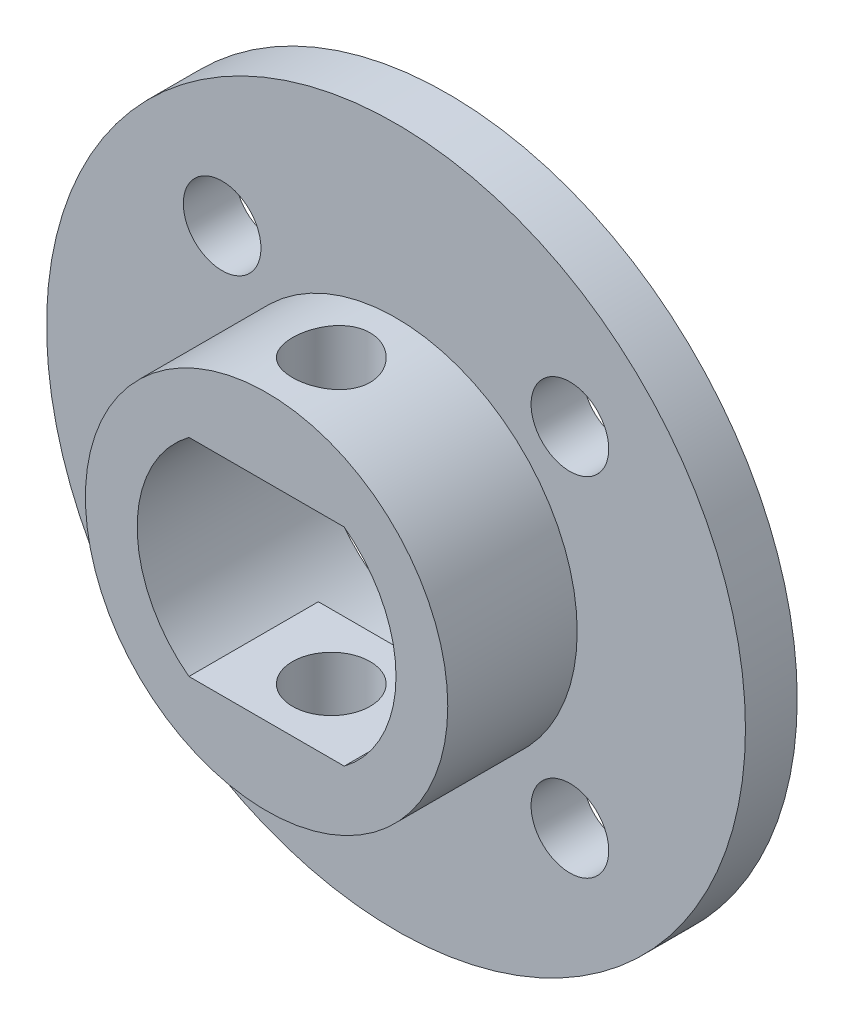
ISO-10303-21;
HEADER;
FILE_DESCRIPTION(('STEP AP214'),'2;1');
FILE_NAME('part.step','',(''),(''),'','','');
FILE_SCHEMA(('AUTOMOTIVE_DESIGN { 1 0 10303 214 1 1 1 1 }'));
ENDSEC;
DATA;
#1=APPLICATION_CONTEXT('core data for automotive mechanical design processes');
#2=APPLICATION_PROTOCOL_DEFINITION('international standard','automotive_design',2000,#1);
#3=PRODUCT_CONTEXT('',#1,'mechanical');
#4=PRODUCT('Part','Part','',(#3));
#5=PRODUCT_RELATED_PRODUCT_CATEGORY('part','',(#4));
#6=PRODUCT_DEFINITION_FORMATION('','',#4);
#7=PRODUCT_DEFINITION_CONTEXT('part definition',#1,'design');
#8=PRODUCT_DEFINITION('design','',#6,#7);
#9=PRODUCT_DEFINITION_SHAPE('','',#8);
#10=(LENGTH_UNIT() NAMED_UNIT(*) SI_UNIT(.MILLI.,.METRE.));
#11=(NAMED_UNIT(*) PLANE_ANGLE_UNIT() SI_UNIT($,.RADIAN.));
#12=(NAMED_UNIT(*) SI_UNIT($,.STERADIAN.) SOLID_ANGLE_UNIT());
#13=UNCERTAINTY_MEASURE_WITH_UNIT(LENGTH_MEASURE(1.E-05),#10,'distance_accuracy_value','');
#14=(GEOMETRIC_REPRESENTATION_CONTEXT(3) GLOBAL_UNCERTAINTY_ASSIGNED_CONTEXT((#13)) GLOBAL_UNIT_ASSIGNED_CONTEXT((#10,
#11,#12)) REPRESENTATION_CONTEXT('',''));
#15=CARTESIAN_POINT('',(0.,0.,0.));
#16=DIRECTION('',(0.,0.,1.));
#17=DIRECTION('',(1.,0.,0.));
#18=AXIS2_PLACEMENT_3D('',#15,#16,#17);
#19=CARTESIAN_POINT('',(-3.,4.,0.));
#20=DIRECTION('',(0.,1.,0.));
#21=DIRECTION('',(0.,0.,1.));
#22=AXIS2_PLACEMENT_3D('',#19,#20,#21);
#23=PLANE('',#22);
#24=CARTESIAN_POINT('',(0.,4.,4.5));
#25=DIRECTION('',(0.,1.,0.));
#26=DIRECTION('',(0.,0.,1.));
#27=AXIS2_PLACEMENT_3D('',#24,#25,#26);
#28=CIRCLE('',#27,1.5);
#29=CARTESIAN_POINT('',(0.,4.,6.));
#30=VERTEX_POINT('',#29);
#31=EDGE_CURVE('E136',#30,#30,#28,.T.);
#32=ORIENTED_EDGE('',*,*,#31,.T.);
#33=EDGE_LOOP('',(#32));
#34=FACE_BOUND('',#33,.T.);
#35=DIRECTION('',(-1.,0.,0.));
#36=VECTOR('',#35,1.);
#37=CARTESIAN_POINT('',(-3.,4.,2.));
#38=LINE('',#37,#36);
#39=CARTESIAN_POINT('',(3.,4.,2.));
#40=VERTEX_POINT('',#39);
#41=CARTESIAN_POINT('',(-3.,4.,2.));
#42=VERTEX_POINT('',#41);
#43=EDGE_CURVE('E72',#40,#42,#38,.T.);
#44=ORIENTED_EDGE('',*,*,#43,.F.);
#45=DIRECTION('',(0.,0.,1.));
#46=VECTOR('',#45,1.);
#47=CARTESIAN_POINT('',(3.,4.,0.));
#48=LINE('',#47,#46);
#49=CARTESIAN_POINT('',(3.,4.,7.));
#50=VERTEX_POINT('',#49);
#51=EDGE_CURVE('E86',#40,#50,#48,.T.);
#52=ORIENTED_EDGE('',*,*,#51,.T.);
#53=DIRECTION('',(-1.,0.,0.));
#54=VECTOR('',#53,1.);
#55=CARTESIAN_POINT('',(-3.,4.,7.));
#56=LINE('',#55,#54);
#57=CARTESIAN_POINT('',(-3.,4.,7.));
#58=VERTEX_POINT('',#57);
#59=EDGE_CURVE('E89',#50,#58,#56,.T.);
#60=ORIENTED_EDGE('',*,*,#59,.T.);
#61=DIRECTION('',(0.,0.,1.));
#62=VECTOR('',#61,1.);
#63=CARTESIAN_POINT('',(-3.,4.,0.));
#64=LINE('',#63,#62);
#65=EDGE_CURVE('E83',#42,#58,#64,.T.);
#66=ORIENTED_EDGE('',*,*,#65,.F.);
#67=EDGE_LOOP('',(#44,#52,#60,#66));
#68=FACE_BOUND('',#67,.T.);
#69=ADVANCED_FACE('F35',(#34,#68),#23,.F.);
#70=CARTESIAN_POINT('',(-3.,-4.,0.));
#71=DIRECTION('',(0.,-1.,0.));
#72=DIRECTION('',(0.,0.,-1.));
#73=AXIS2_PLACEMENT_3D('',#70,#71,#72);
#74=PLANE('',#73);
#75=CARTESIAN_POINT('',(0.,-4.,4.5));
#76=DIRECTION('',(0.,-1.,0.));
#77=DIRECTION('',(0.,0.,-1.));
#78=AXIS2_PLACEMENT_3D('',#75,#76,#77);
#79=CIRCLE('',#78,1.5);
#80=CARTESIAN_POINT('',(0.,-4.,3.));
#81=VERTEX_POINT('',#80);
#82=EDGE_CURVE('E77',#81,#81,#79,.T.);
#83=ORIENTED_EDGE('',*,*,#82,.T.);
#84=EDGE_LOOP('',(#83));
#85=FACE_BOUND('',#84,.T.);
#86=DIRECTION('',(1.,0.,0.));
#87=VECTOR('',#86,1.);
#88=CARTESIAN_POINT('',(-3.,-4.,2.));
#89=LINE('',#88,#87);
#90=CARTESIAN_POINT('',(-3.,-4.,2.));
#91=VERTEX_POINT('',#90);
#92=CARTESIAN_POINT('',(3.,-4.,2.));
#93=VERTEX_POINT('',#92);
#94=EDGE_CURVE('E11',#91,#93,#89,.T.);
#95=ORIENTED_EDGE('',*,*,#94,.F.);
#96=DIRECTION('',(0.,0.,1.));
#97=VECTOR('',#96,1.);
#98=CARTESIAN_POINT('',(-3.,-4.,0.));
#99=LINE('',#98,#97);
#100=CARTESIAN_POINT('',(-3.,-4.,7.));
#101=VERTEX_POINT('',#100);
#102=EDGE_CURVE('E102',#91,#101,#99,.T.);
#103=ORIENTED_EDGE('',*,*,#102,.T.);
#104=DIRECTION('',(1.,0.,0.));
#105=VECTOR('',#104,1.);
#106=CARTESIAN_POINT('',(-3.,-4.,7.));
#107=LINE('',#106,#105);
#108=CARTESIAN_POINT('',(3.,-4.,7.));
#109=VERTEX_POINT('',#108);
#110=EDGE_CURVE('E309',#101,#109,#107,.T.);
#111=ORIENTED_EDGE('',*,*,#110,.T.);
#112=DIRECTION('',(0.,0.,1.));
#113=VECTOR('',#112,1.);
#114=CARTESIAN_POINT('',(3.,-4.,0.));
#115=LINE('',#114,#113);
#116=EDGE_CURVE('E96',#93,#109,#115,.T.);
#117=ORIENTED_EDGE('',*,*,#116,.F.);
#118=EDGE_LOOP('',(#95,#103,#111,#117));
#119=FACE_BOUND('',#118,.T.);
#120=ADVANCED_FACE('F170',(#85,#119),#74,.F.);
#121=CARTESIAN_POINT('',(0.,0.,2.));
#122=DIRECTION('',(0.,0.,1.));
#123=DIRECTION('',(1.,0.,0.));
#124=AXIS2_PLACEMENT_3D('',#121,#122,#123);
#125=PLANE('',#124);
#126=CARTESIAN_POINT('',(0.,0.,2.));
#127=DIRECTION('',(0.,0.,1.));
#128=DIRECTION('',(1.,0.,0.));
#129=AXIS2_PLACEMENT_3D('',#126,#127,#128);
#130=CIRCLE('',#129,7.);
#131=CARTESIAN_POINT('',(7.,0.,2.));
#132=VERTEX_POINT('',#131);
#133=EDGE_CURVE('E91',#132,#132,#130,.T.);
#134=ORIENTED_EDGE('',*,*,#133,.F.);
#135=EDGE_LOOP('',(#134));
#136=FACE_BOUND('',#135,.T.);
#137=CARTESIAN_POINT('',(-6.71751442127186,-6.71751442127254,2.));
#138=DIRECTION('',(0.,0.,1.));
#139=DIRECTION('',(1.,0.,0.));
#140=AXIS2_PLACEMENT_3D('',#137,#138,#139);
#141=CIRCLE('',#140,1.50000000000028);
#142=CARTESIAN_POINT('',(-5.21751442127158,-6.71751442127254,2.));
#143=VERTEX_POINT('',#142);
#144=EDGE_CURVE('E114',#143,#143,#141,.T.);
#145=ORIENTED_EDGE('',*,*,#144,.F.);
#146=EDGE_LOOP('',(#145));
#147=FACE_BOUND('',#146,.T.);
#148=CARTESIAN_POINT('',(6.71751442127224,6.71751442127217,2.));
#149=DIRECTION('',(0.,0.,1.));
#150=DIRECTION('',(1.,0.,0.));
#151=AXIS2_PLACEMENT_3D('',#148,#149,#150);
#152=CIRCLE('',#151,1.5);
#153=CARTESIAN_POINT('',(8.21751442127224,6.71751442127217,2.));
#154=VERTEX_POINT('',#153);
#155=EDGE_CURVE('E126',#154,#154,#152,.T.);
#156=ORIENTED_EDGE('',*,*,#155,.F.);
#157=EDGE_LOOP('',(#156));
#158=FACE_BOUND('',#157,.T.);
#159=CARTESIAN_POINT('',(0.,0.,2.));
#160=DIRECTION('',(0.,0.,1.));
#161=DIRECTION('',(1.,0.,0.));
#162=AXIS2_PLACEMENT_3D('',#159,#160,#161);
#163=CIRCLE('',#162,13.5);
#164=CARTESIAN_POINT('',(13.5,0.,2.));
#165=VERTEX_POINT('',#164);
#166=EDGE_CURVE('E43',#165,#165,#163,.T.);
#167=ORIENTED_EDGE('',*,*,#166,.T.);
#168=EDGE_LOOP('',(#167));
#169=FACE_BOUND('',#168,.T.);
#170=CARTESIAN_POINT('',(6.71751442127254,-6.71751442127224,2.));
#171=DIRECTION('',(0.,0.,1.));
#172=DIRECTION('',(1.,0.,0.));
#173=AXIS2_PLACEMENT_3D('',#170,#171,#172);
#174=CIRCLE('',#173,1.49999999999991);
#175=CARTESIAN_POINT('',(8.21751442127245,-6.71751442127224,2.));
#176=VERTEX_POINT('',#175);
#177=EDGE_CURVE('E120',#176,#176,#174,.T.);
#178=ORIENTED_EDGE('',*,*,#177,.F.);
#179=EDGE_LOOP('',(#178));
#180=FACE_BOUND('',#179,.T.);
#181=CARTESIAN_POINT('',(-6.71751442127217,6.71751442127186,2.));
#182=DIRECTION('',(0.,0.,1.));
#183=DIRECTION('',(1.,0.,0.));
#184=AXIS2_PLACEMENT_3D('',#181,#182,#183);
#185=CIRCLE('',#184,1.50000000000041);
#186=CARTESIAN_POINT('',(-5.21751442127176,6.71751442127186,2.));
#187=VERTEX_POINT('',#186);
#188=EDGE_CURVE('E108',#187,#187,#185,.T.);
#189=ORIENTED_EDGE('',*,*,#188,.F.);
#190=EDGE_LOOP('',(#189));
#191=FACE_BOUND('',#190,.T.);
#192=ADVANCED_FACE('F173',(#136,#147,#158,#169,#180,#191),#125,.T.);
#193=CARTESIAN_POINT('',(0.,0.,0.));
#194=DIRECTION('',(0.,0.,1.));
#195=DIRECTION('',(1.,0.,0.));
#196=AXIS2_PLACEMENT_3D('',#193,#194,#195);
#197=PLANE('',#196);
#198=CARTESIAN_POINT('',(0.,0.,0.));
#199=DIRECTION('',(0.,0.,1.));
#200=DIRECTION('',(1.,0.,0.));
#201=AXIS2_PLACEMENT_3D('',#198,#199,#200);
#202=CIRCLE('',#201,5.);
#203=CARTESIAN_POINT('',(5.,0.,0.));
#204=VERTEX_POINT('',#203);
#205=EDGE_CURVE('E104',#204,#204,#202,.T.);
#206=ORIENTED_EDGE('',*,*,#205,.T.);
#207=EDGE_LOOP('',(#206));
#208=FACE_BOUND('',#207,.T.);
#209=CARTESIAN_POINT('',(0.,0.,0.));
#210=DIRECTION('',(0.,0.,1.));
#211=DIRECTION('',(1.,0.,0.));
#212=AXIS2_PLACEMENT_3D('',#209,#210,#211);
#213=CIRCLE('',#212,13.5);
#214=CARTESIAN_POINT('',(13.5,0.,0.));
#215=VERTEX_POINT('',#214);
#216=EDGE_CURVE('E129',#215,#215,#213,.T.);
#217=ORIENTED_EDGE('',*,*,#216,.F.);
#218=EDGE_LOOP('',(#217));
#219=FACE_BOUND('',#218,.T.);
#220=CARTESIAN_POINT('',(6.71751442127224,6.71751442127217,0.));
#221=DIRECTION('',(0.,0.,1.));
#222=DIRECTION('',(1.,0.,0.));
#223=AXIS2_PLACEMENT_3D('',#220,#221,#222);
#224=CIRCLE('',#223,1.5);
#225=CARTESIAN_POINT('',(8.21751442127224,6.71751442127217,0.));
#226=VERTEX_POINT('',#225);
#227=EDGE_CURVE('E123',#226,#226,#224,.T.);
#228=ORIENTED_EDGE('',*,*,#227,.T.);
#229=EDGE_LOOP('',(#228));
#230=FACE_BOUND('',#229,.T.);
#231=CARTESIAN_POINT('',(6.71751442127254,-6.71751442127224,0.));
#232=DIRECTION('',(0.,0.,1.));
#233=DIRECTION('',(1.,0.,0.));
#234=AXIS2_PLACEMENT_3D('',#231,#232,#233);
#235=CIRCLE('',#234,1.49999999999991);
#236=CARTESIAN_POINT('',(8.21751442127245,-6.71751442127224,0.));
#237=VERTEX_POINT('',#236);
#238=EDGE_CURVE('E117',#237,#237,#235,.T.);
#239=ORIENTED_EDGE('',*,*,#238,.T.);
#240=EDGE_LOOP('',(#239));
#241=FACE_BOUND('',#240,.T.);
#242=CARTESIAN_POINT('',(-6.71751442127186,-6.71751442127254,0.));
#243=DIRECTION('',(0.,0.,1.));
#244=DIRECTION('',(1.,0.,0.));
#245=AXIS2_PLACEMENT_3D('',#242,#243,#244);
#246=CIRCLE('',#245,1.50000000000028);
#247=CARTESIAN_POINT('',(-5.21751442127158,-6.71751442127254,0.));
#248=VERTEX_POINT('',#247);
#249=EDGE_CURVE('E111',#248,#248,#246,.T.);
#250=ORIENTED_EDGE('',*,*,#249,.T.);
#251=EDGE_LOOP('',(#250));
#252=FACE_BOUND('',#251,.T.);
#253=CARTESIAN_POINT('',(-6.71751442127217,6.71751442127186,0.));
#254=DIRECTION('',(0.,0.,1.));
#255=DIRECTION('',(1.,0.,0.));
#256=AXIS2_PLACEMENT_3D('',#253,#254,#255);
#257=CIRCLE('',#256,1.50000000000041);
#258=CARTESIAN_POINT('',(-5.21751442127176,6.71751442127186,0.));
#259=VERTEX_POINT('',#258);
#260=EDGE_CURVE('E106',#259,#259,#257,.T.);
#261=ORIENTED_EDGE('',*,*,#260,.T.);
#262=EDGE_LOOP('',(#261));
#263=FACE_BOUND('',#262,.T.);
#264=ADVANCED_FACE('F193',(#208,#219,#230,#241,#252,#263),#197,.F.);
#265=CARTESIAN_POINT('',(0.,0.,2.));
#266=DIRECTION('',(0.,0.,-1.));
#267=DIRECTION('',(-1.,0.,0.));
#268=AXIS2_PLACEMENT_3D('',#265,#266,#267);
#269=CYLINDRICAL_SURFACE('',#268,13.5);
#270=ORIENTED_EDGE('',*,*,#166,.F.);
#271=EDGE_LOOP('',(#270));
#272=FACE_BOUND('',#271,.T.);
#273=ORIENTED_EDGE('',*,*,#216,.T.);
#274=EDGE_LOOP('',(#273));
#275=FACE_BOUND('',#274,.T.);
#276=ADVANCED_FACE('F37',(#272,#275),#269,.T.);
#277=CARTESIAN_POINT('',(6.71751442127224,6.71751442127217,2.));
#278=DIRECTION('',(0.,0.,-1.));
#279=DIRECTION('',(-1.,0.,0.));
#280=AXIS2_PLACEMENT_3D('',#277,#278,#279);
#281=CYLINDRICAL_SURFACE('',#280,1.5);
#282=ORIENTED_EDGE('',*,*,#155,.T.);
#283=EDGE_LOOP('',(#282));
#284=FACE_BOUND('',#283,.T.);
#285=ORIENTED_EDGE('',*,*,#227,.F.);
#286=EDGE_LOOP('',(#285));
#287=FACE_BOUND('',#286,.T.);
#288=ADVANCED_FACE('F215',(#284,#287),#281,.F.);
#289=CARTESIAN_POINT('',(6.71751442127254,-6.71751442127224,2.));
#290=DIRECTION('',(0.,0.,-1.));
#291=DIRECTION('',(-1.,0.,0.));
#292=AXIS2_PLACEMENT_3D('',#289,#290,#291);
#293=CYLINDRICAL_SURFACE('',#292,1.49999999999991);
#294=ORIENTED_EDGE('',*,*,#177,.T.);
#295=EDGE_LOOP('',(#294));
#296=FACE_BOUND('',#295,.T.);
#297=ORIENTED_EDGE('',*,*,#238,.F.);
#298=EDGE_LOOP('',(#297));
#299=FACE_BOUND('',#298,.T.);
#300=ADVANCED_FACE('F222',(#296,#299),#293,.F.);
#301=CARTESIAN_POINT('',(-6.71751442127186,-6.71751442127254,2.));
#302=DIRECTION('',(0.,0.,-1.));
#303=DIRECTION('',(-1.,0.,0.));
#304=AXIS2_PLACEMENT_3D('',#301,#302,#303);
#305=CYLINDRICAL_SURFACE('',#304,1.50000000000028);
#306=ORIENTED_EDGE('',*,*,#144,.T.);
#307=EDGE_LOOP('',(#306));
#308=FACE_BOUND('',#307,.T.);
#309=ORIENTED_EDGE('',*,*,#249,.F.);
#310=EDGE_LOOP('',(#309));
#311=FACE_BOUND('',#310,.T.);
#312=ADVANCED_FACE('F207',(#308,#311),#305,.F.);
#313=CARTESIAN_POINT('',(-6.71751442127217,6.71751442127186,2.));
#314=DIRECTION('',(0.,0.,-1.));
#315=DIRECTION('',(-1.,0.,0.));
#316=AXIS2_PLACEMENT_3D('',#313,#314,#315);
#317=CYLINDRICAL_SURFACE('',#316,1.50000000000041);
#318=ORIENTED_EDGE('',*,*,#188,.T.);
#319=EDGE_LOOP('',(#318));
#320=FACE_BOUND('',#319,.T.);
#321=ORIENTED_EDGE('',*,*,#260,.F.);
#322=EDGE_LOOP('',(#321));
#323=FACE_BOUND('',#322,.T.);
#324=ADVANCED_FACE('F181',(#320,#323),#317,.F.);
#325=CARTESIAN_POINT('',(0.,0.,7.));
#326=DIRECTION('',(0.,0.,-1.));
#327=DIRECTION('',(-1.,0.,0.));
#328=AXIS2_PLACEMENT_3D('',#325,#326,#327);
#329=CYLINDRICAL_SURFACE('',#328,7.);
#330=CARTESIAN_POINT('',(0.,7.,3.));
#331=CARTESIAN_POINT('',(0.0832358860906166,6.99999846043226,3.0000028995743));
#332=CARTESIAN_POINT('',(0.166507195600275,6.9985002594971,3.00695160838786));
#333=CARTESIAN_POINT('',(0.330687344293327,6.99266829827728,3.03453565685359));
#334=CARTESIAN_POINT('',(0.41159440357119,6.98833245637099,3.05518104419493));
#335=CARTESIAN_POINT('',(0.568649323817737,6.97730831788827,3.10948436460804));
#336=CARTESIAN_POINT('',(0.644801963446556,6.97062242967171,3.14312897938132));
#337=CARTESIAN_POINT('',(0.790378177960787,6.95562106817971,3.22243408617126));
#338=CARTESIAN_POINT('',(0.859801981747369,6.94730565036661,3.26809416924994));
#339=CARTESIAN_POINT('',(0.991024790535229,6.92981369246311,3.37088029967351));
#340=CARTESIAN_POINT('',(1.05270503419445,6.92062683143259,3.42815622189853));
#341=CARTESIAN_POINT('',(1.16566042389435,6.90250069814144,3.5522263156852));
#342=CARTESIAN_POINT('',(1.21693467150908,6.8935614473163,3.61902130825126));
#343=CARTESIAN_POINT('',(1.30814204379809,6.87684116047225,3.76110575286043));
#344=CARTESIAN_POINT('',(1.34794958335009,6.8690733634436,3.83647751775621));
#345=CARTESIAN_POINT('',(1.41428823691148,6.85572325558537,3.99303445376684));
#346=CARTESIAN_POINT('',(1.44082087001716,6.85014069470711,4.07421895849257));
#347=CARTESIAN_POINT('',(1.47946574422454,6.84189808926311,4.23881108658808));
#348=CARTESIAN_POINT('',(1.49178779748342,6.83919556896486,4.32216727566387));
#349=CARTESIAN_POINT('',(1.50231395206577,6.83689139845106,4.489804232507));
#350=CARTESIAN_POINT('',(1.50051971664629,6.83728938291729,4.57408489017995));
#351=CARTESIAN_POINT('',(1.48303326340861,6.84110276603832,4.73962468793379));
#352=CARTESIAN_POINT('',(1.46758398649408,6.84446541682162,4.82091088910015));
#353=CARTESIAN_POINT('',(1.42361054298677,6.85374593375788,4.97971024028934));
#354=CARTESIAN_POINT('',(1.39508566936466,6.85966393808402,5.05722318603232));
#355=CARTESIAN_POINT('',(1.32554551075991,6.87344080755724,5.20696287287334));
#356=CARTESIAN_POINT('',(1.2844361097283,6.88131420983365,5.27914451271255));
#357=CARTESIAN_POINT('',(1.19096007283993,6.89810572501288,5.41567516495796));
#358=CARTESIAN_POINT('',(1.13859196103562,6.90702397481896,5.4800231486862));
#359=CARTESIAN_POINT('',(1.0227954275532,6.92512718393878,5.6004593556734));
#360=CARTESIAN_POINT('',(0.95916023396441,6.93431383972178,5.65634870658474));
#361=CARTESIAN_POINT('',(0.823317306269096,6.95175017497059,5.75669373368966));
#362=CARTESIAN_POINT('',(0.7511094287754,6.95999983875972,5.80114921860039));
#363=CARTESIAN_POINT('',(0.599933462049959,6.97465778534003,5.87741067990693));
#364=CARTESIAN_POINT('',(0.520952258863482,6.98106238643354,5.90919141257798));
#365=CARTESIAN_POINT('',(0.358603146685706,6.99128109245334,5.95897564832109));
#366=CARTESIAN_POINT('',(0.275235851133669,6.99509555860384,5.97698107256332));
#367=CARTESIAN_POINT('',(0.108187670836629,6.99965306347808,5.99841621414342));
#368=CARTESIAN_POINT('',(0.0245431772716143,7.00045336521066,6.00211771288178));
#369=CARTESIAN_POINT('',(-0.142168973650405,6.99905248935969,5.99557542887484));
#370=CARTESIAN_POINT('',(-0.225236668127255,6.99685150675698,5.98533255203706));
#371=CARTESIAN_POINT('',(-0.387542537982806,6.98973143045266,5.9514177563383));
#372=CARTESIAN_POINT('',(-0.466811712908478,6.9848410504546,5.92788763052747));
#373=CARTESIAN_POINT('',(-0.620278450473418,6.9728892442151,5.86822305700518));
#374=CARTESIAN_POINT('',(-0.69447559258774,6.96582763822237,5.83208756568835));
#375=CARTESIAN_POINT('',(-0.836821397964754,6.950175043904,5.74766645693967));
#376=CARTESIAN_POINT('',(-0.90487257511114,6.94156431354275,5.69922020509027));
#377=CARTESIAN_POINT('',(-1.0319769255236,6.92381033034847,5.59176517511126));
#378=CARTESIAN_POINT('',(-1.091028978692,6.91466701142097,5.53275508411256));
#379=CARTESIAN_POINT('',(-1.19952711057989,6.89668172706324,5.40460262981286));
#380=CARTESIAN_POINT('',(-1.24878537255156,6.88784792221285,5.3352999007779));
#381=CARTESIAN_POINT('',(-1.3349641538604,6.87166654559681,5.18924540352201));
#382=CARTESIAN_POINT('',(-1.37188519913706,6.86431891048055,5.11249395302251));
#383=CARTESIAN_POINT('',(-1.43209741248548,6.8520100980739,4.9541277010054));
#384=CARTESIAN_POINT('',(-1.45546398641275,6.84703574582967,4.87254264356933));
#385=CARTESIAN_POINT('',(-1.48812696085335,6.84001186708418,4.70648441616636));
#386=CARTESIAN_POINT('',(-1.49742550780258,6.83796189439706,4.62201168879868));
#387=CARTESIAN_POINT('',(-1.5015999992604,6.83704618848155,4.45446765682476));
#388=CARTESIAN_POINT('',(-1.49677347258311,6.83811476518543,4.37140398501942));
#389=CARTESIAN_POINT('',(-1.47349789406331,6.8431676318483,4.20730275786741));
#390=CARTESIAN_POINT('',(-1.45504898957979,6.84715189026714,4.12626518061343));
#391=CARTESIAN_POINT('',(-1.40519345940434,6.85755581104157,3.96874134213083));
#392=CARTESIAN_POINT('',(-1.37382847170887,6.86396764224703,3.89224135133571));
#393=CARTESIAN_POINT('',(-1.29906751595601,6.87850764590649,3.74554462749315));
#394=CARTESIAN_POINT('',(-1.255670353015,6.88663598880363,3.67534852138496));
#395=CARTESIAN_POINT('',(-1.15708290349304,6.90389055593232,3.54178180627463));
#396=CARTESIAN_POINT('',(-1.10167987421237,6.91303309938926,3.47857030405302));
#397=CARTESIAN_POINT('',(-0.98108655461962,6.93117449799694,3.36224373747954));
#398=CARTESIAN_POINT('',(-0.915894009385596,6.94017331951296,3.30913100568779));
#399=CARTESIAN_POINT('',(-0.776603147268717,6.95714491048987,3.21388404049444));
#400=CARTESIAN_POINT('',(-0.702404846009641,6.96510364570626,3.17189339376902));
#401=CARTESIAN_POINT('',(-0.547850160940598,6.97895826104019,3.10104547109382));
#402=CARTESIAN_POINT('',(-0.467499105863879,6.98485590212343,3.07217697741497));
#403=CARTESIAN_POINT('',(-0.322535217553203,6.99284848461772,3.03364781486885));
#404=CARTESIAN_POINT('',(-0.258717205545978,6.99551391888263,3.02105356601997));
#405=CARTESIAN_POINT('',(-0.129939960853846,6.99909024154719,3.00422869828833));
#406=CARTESIAN_POINT('',(-0.0649807750887446,7.00000120191314,2.99999773635394));
#407=CARTESIAN_POINT('',(0.,7.,3.));
#408=B_SPLINE_CURVE_WITH_KNOTS('',3,(#330,#331,#332,#333,#334,#335,#336,#337,#338,#339,#340,
#341,#342,#343,#344,#345,#346,#347,#348,#349,#350,#351,#352,#353,#354,#355,#356,#357,#358,#359,
#360,#361,#362,#363,#364,#365,#366,#367,#368,#369,#370,#371,#372,#373,#374,#375,#376,#377,#378,
#379,#380,#381,#382,#383,#384,#385,#386,#387,#388,#389,#390,#391,#392,#393,#394,#395,#396,#397,
#398,#399,#400,#401,#402,#403,#404,#405,#406,#407),.UNSPECIFIED.,.T.,.F.,(4,2,2,2,2,2,2,2,2,2,2,
2,2,2,2,2,2,2,2,2,2,2,2,2,2,2,2,2,2,2,2,2,2,2,2,2,2,2,4),(0.,0.249469836512082,
0.499122883219936,0.748520824425602,0.997910278645886,1.25074961881732,1.50361077918506,
1.7591442921451,2.0146485567749,2.26633008124666,2.51798195169165,2.76524475452927,
3.01252092904568,3.26169356165968,3.51089887920889,3.76527011050291,4.0196455970235,
4.27452521139806,4.52936927256343,4.77934665704185,5.02930780231429,5.27665060589267,
5.52401389198434,5.77478733867803,6.02559197304485,6.28082063283534,6.53603841075806,
6.78982240408475,7.04356767229185,7.29200680540294,7.5404432510827,7.78808499706785,
8.03575134451623,8.28822950154114,8.54076590397115,8.79641910357222,9.05185334010271,
9.24661799132294,9.44137465337336),.UNSPECIFIED.);
#409=CARTESIAN_POINT('',(0.,7.,3.));
#410=VERTEX_POINT('',#409);
#411=EDGE_CURVE('E145',#410,#410,#408,.T.);
#412=ORIENTED_EDGE('',*,*,#411,.T.);
#413=EDGE_LOOP('',(#412));
#414=FACE_BOUND('',#413,.T.);
#415=CARTESIAN_POINT('',(0.,-7.,3.));
#416=CARTESIAN_POINT('',(-0.0832358860906166,-6.99999846043226,3.0000028995743));
#417=CARTESIAN_POINT('',(-0.166507195600275,-6.9985002594971,3.00695160838786));
#418=CARTESIAN_POINT('',(-0.330687344293327,-6.99266829827728,3.03453565685359));
#419=CARTESIAN_POINT('',(-0.41159440357119,-6.98833245637099,3.05518104419493));
#420=CARTESIAN_POINT('',(-0.568649323817737,-6.97730831788827,3.10948436460804));
#421=CARTESIAN_POINT('',(-0.644801963446556,-6.97062242967171,3.14312897938132));
#422=CARTESIAN_POINT('',(-0.790378177960787,-6.95562106817971,3.22243408617126));
#423=CARTESIAN_POINT('',(-0.859801981747369,-6.94730565036661,3.26809416924994));
#424=CARTESIAN_POINT('',(-0.991024790535229,-6.92981369246311,3.37088029967351));
#425=CARTESIAN_POINT('',(-1.05270503419445,-6.92062683143259,3.42815622189853));
#426=CARTESIAN_POINT('',(-1.16566042389435,-6.90250069814144,3.5522263156852));
#427=CARTESIAN_POINT('',(-1.21693467150908,-6.8935614473163,3.61902130825126));
#428=CARTESIAN_POINT('',(-1.30814204379809,-6.87684116047225,3.76110575286043));
#429=CARTESIAN_POINT('',(-1.34794958335009,-6.8690733634436,3.83647751775621));
#430=CARTESIAN_POINT('',(-1.41428823691148,-6.85572325558537,3.99303445376684));
#431=CARTESIAN_POINT('',(-1.44082087001716,-6.85014069470711,4.07421895849257));
#432=CARTESIAN_POINT('',(-1.47946574422454,-6.84189808926311,4.23881108658808));
#433=CARTESIAN_POINT('',(-1.49178779748342,-6.83919556896486,4.32216727566387));
#434=CARTESIAN_POINT('',(-1.50231395206577,-6.83689139845106,4.489804232507));
#435=CARTESIAN_POINT('',(-1.50051971664629,-6.83728938291729,4.57408489017995));
#436=CARTESIAN_POINT('',(-1.48303326340861,-6.84110276603832,4.73962468793379));
#437=CARTESIAN_POINT('',(-1.46758398649408,-6.84446541682162,4.82091088910015));
#438=CARTESIAN_POINT('',(-1.42361054298677,-6.85374593375788,4.97971024028934));
#439=CARTESIAN_POINT('',(-1.39508566936466,-6.85966393808402,5.05722318603232));
#440=CARTESIAN_POINT('',(-1.32554551075991,-6.87344080755724,5.20696287287334));
#441=CARTESIAN_POINT('',(-1.2844361097283,-6.88131420983365,5.27914451271255));
#442=CARTESIAN_POINT('',(-1.19096007283993,-6.89810572501288,5.41567516495796));
#443=CARTESIAN_POINT('',(-1.13859196103562,-6.90702397481896,5.4800231486862));
#444=CARTESIAN_POINT('',(-1.0227954275532,-6.92512718393878,5.6004593556734));
#445=CARTESIAN_POINT('',(-0.95916023396441,-6.93431383972178,5.65634870658474));
#446=CARTESIAN_POINT('',(-0.823317306269096,-6.95175017497059,5.75669373368966));
#447=CARTESIAN_POINT('',(-0.7511094287754,-6.95999983875972,5.80114921860039));
#448=CARTESIAN_POINT('',(-0.599933462049959,-6.97465778534003,5.87741067990693));
#449=CARTESIAN_POINT('',(-0.520952258863482,-6.98106238643354,5.90919141257798));
#450=CARTESIAN_POINT('',(-0.358603146685706,-6.99128109245334,5.95897564832109));
#451=CARTESIAN_POINT('',(-0.275235851133669,-6.99509555860384,5.97698107256332));
#452=CARTESIAN_POINT('',(-0.108187670836629,-6.99965306347808,5.99841621414342));
#453=CARTESIAN_POINT('',(-0.0245431772716143,-7.00045336521066,6.00211771288178));
#454=CARTESIAN_POINT('',(0.142168973650405,-6.99905248935969,5.99557542887484));
#455=CARTESIAN_POINT('',(0.225236668127255,-6.99685150675698,5.98533255203706));
#456=CARTESIAN_POINT('',(0.387542537982806,-6.98973143045266,5.9514177563383));
#457=CARTESIAN_POINT('',(0.466811712908478,-6.9848410504546,5.92788763052747));
#458=CARTESIAN_POINT('',(0.620278450473418,-6.9728892442151,5.86822305700518));
#459=CARTESIAN_POINT('',(0.69447559258774,-6.96582763822237,5.83208756568835));
#460=CARTESIAN_POINT('',(0.836821397964754,-6.950175043904,5.74766645693967));
#461=CARTESIAN_POINT('',(0.90487257511114,-6.94156431354275,5.69922020509027));
#462=CARTESIAN_POINT('',(1.0319769255236,-6.92381033034847,5.59176517511126));
#463=CARTESIAN_POINT('',(1.091028978692,-6.91466701142097,5.53275508411256));
#464=CARTESIAN_POINT('',(1.19952711057989,-6.89668172706324,5.40460262981286));
#465=CARTESIAN_POINT('',(1.24878537255156,-6.88784792221285,5.3352999007779));
#466=CARTESIAN_POINT('',(1.3349641538604,-6.87166654559681,5.18924540352201));
#467=CARTESIAN_POINT('',(1.37188519913706,-6.86431891048055,5.11249395302251));
#468=CARTESIAN_POINT('',(1.43209741248548,-6.8520100980739,4.9541277010054));
#469=CARTESIAN_POINT('',(1.45546398641275,-6.84703574582967,4.87254264356933));
#470=CARTESIAN_POINT('',(1.48812696085335,-6.84001186708418,4.70648441616636));
#471=CARTESIAN_POINT('',(1.49742550780258,-6.83796189439706,4.62201168879868));
#472=CARTESIAN_POINT('',(1.5015999992604,-6.83704618848155,4.45446765682476));
#473=CARTESIAN_POINT('',(1.49677347258311,-6.83811476518543,4.37140398501942));
#474=CARTESIAN_POINT('',(1.47349789406331,-6.8431676318483,4.20730275786741));
#475=CARTESIAN_POINT('',(1.45504898957979,-6.84715189026714,4.12626518061343));
#476=CARTESIAN_POINT('',(1.40519345940434,-6.85755581104157,3.96874134213083));
#477=CARTESIAN_POINT('',(1.37382847170887,-6.86396764224703,3.89224135133571));
#478=CARTESIAN_POINT('',(1.29906751595601,-6.87850764590649,3.74554462749315));
#479=CARTESIAN_POINT('',(1.255670353015,-6.88663598880363,3.67534852138496));
#480=CARTESIAN_POINT('',(1.15708290349304,-6.90389055593232,3.54178180627463));
#481=CARTESIAN_POINT('',(1.10167987421237,-6.91303309938926,3.47857030405302));
#482=CARTESIAN_POINT('',(0.98108655461962,-6.93117449799694,3.36224373747954));
#483=CARTESIAN_POINT('',(0.915894009385596,-6.94017331951296,3.30913100568779));
#484=CARTESIAN_POINT('',(0.776603147268717,-6.95714491048987,3.21388404049444));
#485=CARTESIAN_POINT('',(0.702404846009641,-6.96510364570626,3.17189339376902));
#486=CARTESIAN_POINT('',(0.547850160940598,-6.97895826104019,3.10104547109382));
#487=CARTESIAN_POINT('',(0.467499105863879,-6.98485590212343,3.07217697741497));
#488=CARTESIAN_POINT('',(0.322535217553203,-6.99284848461772,3.03364781486885));
#489=CARTESIAN_POINT('',(0.258717205545978,-6.99551391888263,3.02105356601997));
#490=CARTESIAN_POINT('',(0.129939960853846,-6.99909024154719,3.00422869828833));
#491=CARTESIAN_POINT('',(0.0649807750887446,-7.00000120191314,2.99999773635394));
#492=CARTESIAN_POINT('',(0.,-7.,3.));
#493=B_SPLINE_CURVE_WITH_KNOTS('',3,(#415,#416,#417,#418,#419,#420,#421,#422,#423,#424,#425,
#426,#427,#428,#429,#430,#431,#432,#433,#434,#435,#436,#437,#438,#439,#440,#441,#442,#443,#444,
#445,#446,#447,#448,#449,#450,#451,#452,#453,#454,#455,#456,#457,#458,#459,#460,#461,#462,#463,
#464,#465,#466,#467,#468,#469,#470,#471,#472,#473,#474,#475,#476,#477,#478,#479,#480,#481,#482,
#483,#484,#485,#486,#487,#488,#489,#490,#491,#492),.UNSPECIFIED.,.T.,.F.,(4,2,2,2,2,2,2,2,2,2,2,
2,2,2,2,2,2,2,2,2,2,2,2,2,2,2,2,2,2,2,2,2,2,2,2,2,2,2,4),(0.,0.249469836512082,
0.499122883219936,0.748520824425602,0.997910278645886,1.25074961881732,1.50361077918506,
1.7591442921451,2.0146485567749,2.26633008124666,2.51798195169165,2.76524475452927,
3.01252092904568,3.26169356165968,3.51089887920889,3.76527011050291,4.0196455970235,
4.27452521139806,4.52936927256343,4.77934665704185,5.02930780231429,5.27665060589267,
5.52401389198434,5.77478733867803,6.02559197304485,6.28082063283534,6.53603841075806,
6.78982240408475,7.04356767229185,7.29200680540294,7.5404432510827,7.78808499706785,
8.03575134451623,8.28822950154114,8.54076590397115,8.79641910357222,9.05185334010271,
9.24661799132294,9.44137465337336),.UNSPECIFIED.);
#494=CARTESIAN_POINT('',(0.,-7.,3.));
#495=VERTEX_POINT('',#494);
#496=EDGE_CURVE('E140',#495,#495,#493,.T.);
#497=ORIENTED_EDGE('',*,*,#496,.T.);
#498=EDGE_LOOP('',(#497));
#499=FACE_BOUND('',#498,.T.);
#500=CARTESIAN_POINT('',(0.,0.,7.));
#501=DIRECTION('',(0.,0.,1.));
#502=DIRECTION('',(1.,0.,0.));
#503=AXIS2_PLACEMENT_3D('',#500,#501,#502);
#504=CIRCLE('',#503,7.);
#505=CARTESIAN_POINT('',(7.,0.,7.));
#506=VERTEX_POINT('',#505);
#507=EDGE_CURVE('E94',#506,#506,#504,.T.);
#508=ORIENTED_EDGE('',*,*,#507,.F.);
#509=EDGE_LOOP('',(#508));
#510=FACE_BOUND('',#509,.T.);
#511=ORIENTED_EDGE('',*,*,#133,.T.);
#512=EDGE_LOOP('',(#511));
#513=FACE_BOUND('',#512,.T.);
#514=ADVANCED_FACE('F155',(#414,#499,#510,#513),#329,.T.);
#515=CARTESIAN_POINT('',(0.,0.,7.));
#516=DIRECTION('',(0.,0.,1.));
#517=DIRECTION('',(1.,0.,0.));
#518=AXIS2_PLACEMENT_3D('',#515,#516,#517);
#519=PLANE('',#518);
#520=CARTESIAN_POINT('',(0.,0.,7.));
#521=DIRECTION('',(0.,0.,1.));
#522=DIRECTION('',(1.,0.,0.));
#523=AXIS2_PLACEMENT_3D('',#520,#521,#522);
#524=CIRCLE('',#523,5.);
#525=EDGE_CURVE('E185',#58,#101,#524,.T.);
#526=ORIENTED_EDGE('',*,*,#525,.F.);
#527=ORIENTED_EDGE('',*,*,#59,.F.);
#528=CARTESIAN_POINT('',(0.,0.,7.));
#529=DIRECTION('',(0.,0.,1.));
#530=DIRECTION('',(1.,0.,0.));
#531=AXIS2_PLACEMENT_3D('',#528,#529,#530);
#532=CIRCLE('',#531,5.);
#533=EDGE_CURVE('E311',#109,#50,#532,.T.);
#534=ORIENTED_EDGE('',*,*,#533,.F.);
#535=ORIENTED_EDGE('',*,*,#110,.F.);
#536=EDGE_LOOP('',(#526,#527,#534,#535));
#537=FACE_BOUND('',#536,.T.);
#538=ORIENTED_EDGE('',*,*,#507,.T.);
#539=EDGE_LOOP('',(#538));
#540=FACE_BOUND('',#539,.T.);
#541=ADVANCED_FACE('F175',(#537,#540),#519,.T.);
#542=CARTESIAN_POINT('',(0.,0.,0.));
#543=DIRECTION('',(0.,0.,1.));
#544=DIRECTION('',(1.,0.,0.));
#545=AXIS2_PLACEMENT_3D('',#542,#543,#544);
#546=CYLINDRICAL_SURFACE('',#545,5.);
#547=ORIENTED_EDGE('',*,*,#51,.F.);
#548=CARTESIAN_POINT('',(0.,0.,2.));
#549=DIRECTION('',(0.,0.,-1.));
#550=DIRECTION('',(-1.,0.,0.));
#551=AXIS2_PLACEMENT_3D('',#548,#549,#550);
#552=CIRCLE('',#551,5.);
#553=EDGE_CURVE('E49',#42,#40,#552,.T.);
#554=ORIENTED_EDGE('',*,*,#553,.F.);
#555=ORIENTED_EDGE('',*,*,#65,.T.);
#556=ORIENTED_EDGE('',*,*,#525,.T.);
#557=ORIENTED_EDGE('',*,*,#102,.F.);
#558=EDGE_CURVE('E55',#93,#91,#552,.T.);
#559=ORIENTED_EDGE('',*,*,#558,.F.);
#560=ORIENTED_EDGE('',*,*,#116,.T.);
#561=ORIENTED_EDGE('',*,*,#533,.T.);
#562=EDGE_LOOP('',(#547,#554,#555,#556,#557,#559,#560,#561));
#563=FACE_BOUND('',#562,.T.);
#564=ORIENTED_EDGE('',*,*,#205,.F.);
#565=EDGE_LOOP('',(#564));
#566=FACE_BOUND('',#565,.T.);
#567=ADVANCED_FACE('F80',(#563,#566),#546,.F.);
#568=CARTESIAN_POINT('',(0.,13.5,4.5));
#569=DIRECTION('',(0.,-1.,0.));
#570=DIRECTION('',(0.,0.,-1.));
#571=AXIS2_PLACEMENT_3D('',#568,#569,#570);
#572=CYLINDRICAL_SURFACE('',#571,1.5);
#573=ORIENTED_EDGE('',*,*,#82,.F.);
#574=EDGE_LOOP('',(#573));
#575=FACE_BOUND('',#574,.T.);
#576=ORIENTED_EDGE('',*,*,#496,.F.);
#577=EDGE_LOOP('',(#576));
#578=FACE_BOUND('',#577,.T.);
#579=ADVANCED_FACE('F165',(#575,#578),#572,.F.);
#580=ORIENTED_EDGE('',*,*,#31,.F.);
#581=EDGE_LOOP('',(#580));
#582=FACE_BOUND('',#581,.T.);
#583=ORIENTED_EDGE('',*,*,#411,.F.);
#584=EDGE_LOOP('',(#583));
#585=FACE_BOUND('',#584,.T.);
#586=ADVANCED_FACE('F159',(#582,#585),#572,.F.);
#587=CARTESIAN_POINT('',(0.,0.,2.));
#588=DIRECTION('',(0.,0.,-1.));
#589=DIRECTION('',(-1.,0.,0.));
#590=AXIS2_PLACEMENT_3D('',#587,#588,#589);
#591=PLANE('',#590);
#592=ORIENTED_EDGE('',*,*,#94,.T.);
#593=ORIENTED_EDGE('',*,*,#558,.T.);
#594=EDGE_LOOP('',(#592,#593));
#595=FACE_BOUND('',#594,.T.);
#596=ADVANCED_FACE('F164',(#595),#591,.T.);
#597=ORIENTED_EDGE('',*,*,#43,.T.);
#598=ORIENTED_EDGE('',*,*,#553,.T.);
#599=EDGE_LOOP('',(#597,#598));
#600=FACE_BOUND('',#599,.T.);
#601=ADVANCED_FACE('F73',(#600),#591,.T.);
#602=CLOSED_SHELL('',(#69,#120,#192,#264,#276,#288,#300,#312,#324,#514,#541,#567,#579,#586,#596,#601));
#603=MANIFOLD_SOLID_BREP('B2',#602);
#604=ADVANCED_BREP_SHAPE_REPRESENTATION('',(#18,#603),#14);
#605=SHAPE_DEFINITION_REPRESENTATION(#9,#604);
ENDSEC;
END-ISO-10303-21;
